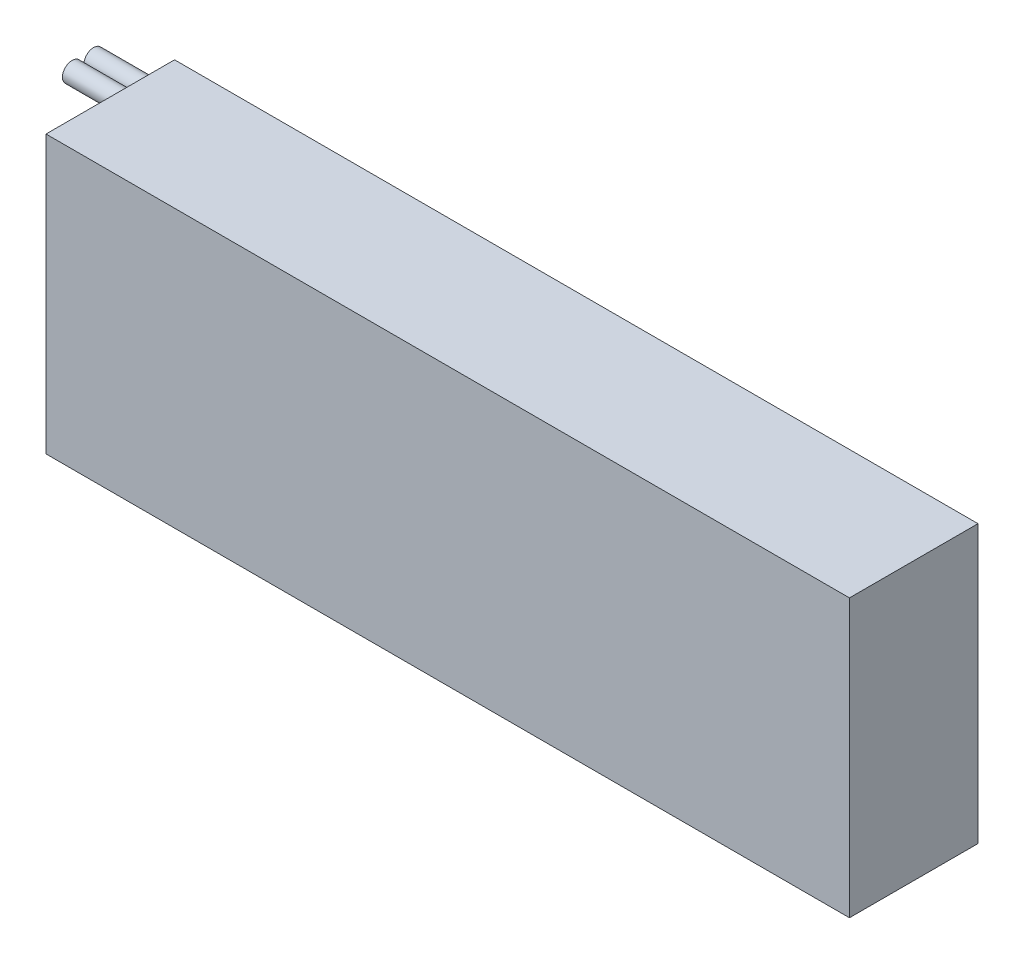
ISO-10303-21;
HEADER;
FILE_DESCRIPTION(('STEP AP214'),'2;1');
FILE_NAME('part.step','',(''),(''),'','','');
FILE_SCHEMA(('AUTOMOTIVE_DESIGN { 1 0 10303 214 1 1 1 1 }'));
ENDSEC;
DATA;
#1=APPLICATION_CONTEXT('core data for automotive mechanical design processes');
#2=APPLICATION_PROTOCOL_DEFINITION('international standard','automotive_design',2000,#1);
#3=PRODUCT_CONTEXT('',#1,'mechanical');
#4=PRODUCT('Part','Part','',(#3));
#5=PRODUCT_RELATED_PRODUCT_CATEGORY('part','',(#4));
#6=PRODUCT_DEFINITION_FORMATION('','',#4);
#7=PRODUCT_DEFINITION_CONTEXT('part definition',#1,'design');
#8=PRODUCT_DEFINITION('design','',#6,#7);
#9=PRODUCT_DEFINITION_SHAPE('','',#8);
#10=(LENGTH_UNIT() NAMED_UNIT(*) SI_UNIT(.MILLI.,.METRE.));
#11=(NAMED_UNIT(*) PLANE_ANGLE_UNIT() SI_UNIT($,.RADIAN.));
#12=(NAMED_UNIT(*) SI_UNIT($,.STERADIAN.) SOLID_ANGLE_UNIT());
#13=UNCERTAINTY_MEASURE_WITH_UNIT(LENGTH_MEASURE(1.E-05),#10,'distance_accuracy_value','');
#14=(GEOMETRIC_REPRESENTATION_CONTEXT(3) GLOBAL_UNCERTAINTY_ASSIGNED_CONTEXT((#13)) GLOBAL_UNIT_ASSIGNED_CONTEXT((#10,
#11,#12)) REPRESENTATION_CONTEXT('',''));
#15=CARTESIAN_POINT('',(0.,0.,0.));
#16=DIRECTION('',(0.,0.,1.));
#17=DIRECTION('',(1.,0.,0.));
#18=AXIS2_PLACEMENT_3D('',#15,#16,#17);
#19=CARTESIAN_POINT('',(-112.129237288136,36.0222457627119,23.2));
#20=DIRECTION('',(1.,0.,0.));
#21=DIRECTION('',(0.,0.,-1.));
#22=AXIS2_PLACEMENT_3D('',#19,#20,#21);
#23=PLANE('',#22);
#24=CARTESIAN_POINT('',(-112.129237288136,33.4218855490107,8.48750413764776));
#25=DIRECTION('',(1.,0.,0.));
#26=DIRECTION('',(0.,0.,-1.));
#27=AXIS2_PLACEMENT_3D('',#24,#25,#26);
#28=CIRCLE('',#27,1.75);
#29=CARTESIAN_POINT('',(-112.129237288136,33.4218855490107,6.73750413764776));
#30=VERTEX_POINT('',#29);
#31=EDGE_CURVE('E11',#30,#30,#28,.F.);
#32=ORIENTED_EDGE('',*,*,#31,.F.);
#33=EDGE_LOOP('',(#32));
#34=FACE_BOUND('',#33,.T.);
#35=CARTESIAN_POINT('',(-112.129237288136,33.4942220454977,4.61164557053451));
#36=DIRECTION('',(1.,0.,0.));
#37=DIRECTION('',(0.,0.,-1.));
#38=AXIS2_PLACEMENT_3D('',#35,#36,#37);
#39=CIRCLE('',#38,1.75);
#40=CARTESIAN_POINT('',(-112.129237288136,33.4942220454977,2.8616455705345));
#41=VERTEX_POINT('',#40);
#42=EDGE_CURVE('E41',#41,#41,#39,.F.);
#43=ORIENTED_EDGE('',*,*,#42,.F.);
#44=EDGE_LOOP('',(#43));
#45=FACE_BOUND('',#44,.T.);
#46=DIRECTION('',(0.,-1.,0.));
#47=VECTOR('',#46,1.);
#48=CARTESIAN_POINT('',(-112.129237288136,36.0222457627119,0.));
#49=LINE('',#48,#47);
#50=CARTESIAN_POINT('',(-112.129237288136,36.0222457627119,0.));
#51=VERTEX_POINT('',#50);
#52=CARTESIAN_POINT('',(-112.129237288136,-13.9777542372881,0.));
#53=VERTEX_POINT('',#52);
#54=EDGE_CURVE('E100',#51,#53,#49,.T.);
#55=ORIENTED_EDGE('',*,*,#54,.T.);
#56=DIRECTION('',(0.,0.,-1.));
#57=VECTOR('',#56,1.);
#58=CARTESIAN_POINT('',(-112.129237288136,-13.9777542372881,23.2));
#59=LINE('',#58,#57);
#60=CARTESIAN_POINT('',(-112.129237288136,-13.9777542372881,23.2));
#61=VERTEX_POINT('',#60);
#62=EDGE_CURVE('E91',#61,#53,#59,.T.);
#63=ORIENTED_EDGE('',*,*,#62,.F.);
#64=DIRECTION('',(0.,-1.,0.));
#65=VECTOR('',#64,1.);
#66=CARTESIAN_POINT('',(-112.129237288136,36.0222457627119,23.2));
#67=LINE('',#66,#65);
#68=CARTESIAN_POINT('',(-112.129237288136,36.0222457627119,23.2));
#69=VERTEX_POINT('',#68);
#70=EDGE_CURVE('E85',#69,#61,#67,.T.);
#71=ORIENTED_EDGE('',*,*,#70,.F.);
#72=DIRECTION('',(0.,0.,-1.));
#73=VECTOR('',#72,1.);
#74=CARTESIAN_POINT('',(-112.129237288136,36.0222457627119,23.2));
#75=LINE('',#74,#73);
#76=EDGE_CURVE('E96',#69,#51,#75,.T.);
#77=ORIENTED_EDGE('',*,*,#76,.T.);
#78=EDGE_LOOP('',(#55,#63,#71,#77));
#79=FACE_BOUND('',#78,.T.);
#80=ADVANCED_FACE('F33',(#34,#45,#79),#23,.F.);
#81=CARTESIAN_POINT('',(-112.129237288136,-13.9777542372881,23.2));
#82=DIRECTION('',(0.,1.,0.));
#83=DIRECTION('',(0.,0.,1.));
#84=AXIS2_PLACEMENT_3D('',#81,#82,#83);
#85=PLANE('',#84);
#86=DIRECTION('',(1.,0.,0.));
#87=VECTOR('',#86,1.);
#88=CARTESIAN_POINT('',(-112.129237288136,-13.9777542372881,0.));
#89=LINE('',#88,#87);
#90=CARTESIAN_POINT('',(32.8707627118644,-13.9777542372881,0.));
#91=VERTEX_POINT('',#90);
#92=EDGE_CURVE('E90',#53,#91,#89,.T.);
#93=ORIENTED_EDGE('',*,*,#92,.T.);
#94=DIRECTION('',(0.,0.,-1.));
#95=VECTOR('',#94,1.);
#96=CARTESIAN_POINT('',(32.8707627118644,-13.9777542372881,23.2));
#97=LINE('',#96,#95);
#98=CARTESIAN_POINT('',(32.8707627118644,-13.9777542372881,23.2));
#99=VERTEX_POINT('',#98);
#100=EDGE_CURVE('E88',#99,#91,#97,.T.);
#101=ORIENTED_EDGE('',*,*,#100,.F.);
#102=DIRECTION('',(1.,0.,0.));
#103=VECTOR('',#102,1.);
#104=CARTESIAN_POINT('',(-112.129237288136,-13.9777542372881,23.2));
#105=LINE('',#104,#103);
#106=EDGE_CURVE('E80',#61,#99,#105,.T.);
#107=ORIENTED_EDGE('',*,*,#106,.F.);
#108=ORIENTED_EDGE('',*,*,#62,.T.);
#109=EDGE_LOOP('',(#93,#101,#107,#108));
#110=FACE_BOUND('',#109,.T.);
#111=ADVANCED_FACE('F89',(#110),#85,.F.);
#112=CARTESIAN_POINT('',(32.8707627118644,36.0222457627119,23.2));
#113=DIRECTION('',(-1.,0.,0.));
#114=DIRECTION('',(0.,0.,1.));
#115=AXIS2_PLACEMENT_3D('',#112,#113,#114);
#116=PLANE('',#115);
#117=DIRECTION('',(0.,1.,0.));
#118=VECTOR('',#117,1.);
#119=CARTESIAN_POINT('',(32.8707627118644,36.0222457627119,0.));
#120=LINE('',#119,#118);
#121=CARTESIAN_POINT('',(32.8707627118644,36.0222457627119,0.));
#122=VERTEX_POINT('',#121);
#123=EDGE_CURVE('E66',#91,#122,#120,.T.);
#124=ORIENTED_EDGE('',*,*,#123,.T.);
#125=DIRECTION('',(0.,0.,-1.));
#126=VECTOR('',#125,1.);
#127=CARTESIAN_POINT('',(32.8707627118644,36.0222457627119,23.2));
#128=LINE('',#127,#126);
#129=CARTESIAN_POINT('',(32.8707627118644,36.0222457627119,23.2));
#130=VERTEX_POINT('',#129);
#131=EDGE_CURVE('E92',#130,#122,#128,.T.);
#132=ORIENTED_EDGE('',*,*,#131,.F.);
#133=DIRECTION('',(0.,1.,0.));
#134=VECTOR('',#133,1.);
#135=CARTESIAN_POINT('',(32.8707627118644,36.0222457627119,23.2));
#136=LINE('',#135,#134);
#137=EDGE_CURVE('E83',#99,#130,#136,.T.);
#138=ORIENTED_EDGE('',*,*,#137,.F.);
#139=ORIENTED_EDGE('',*,*,#100,.T.);
#140=EDGE_LOOP('',(#124,#132,#138,#139));
#141=FACE_BOUND('',#140,.T.);
#142=ADVANCED_FACE('F94',(#141),#116,.F.);
#143=CARTESIAN_POINT('',(-112.129237288136,36.0222457627119,23.2));
#144=DIRECTION('',(0.,-1.,0.));
#145=DIRECTION('',(0.,0.,-1.));
#146=AXIS2_PLACEMENT_3D('',#143,#144,#145);
#147=PLANE('',#146);
#148=DIRECTION('',(-1.,0.,0.));
#149=VECTOR('',#148,1.);
#150=CARTESIAN_POINT('',(-112.129237288136,36.0222457627119,0.));
#151=LINE('',#150,#149);
#152=EDGE_CURVE('E72',#122,#51,#151,.T.);
#153=ORIENTED_EDGE('',*,*,#152,.T.);
#154=ORIENTED_EDGE('',*,*,#76,.F.);
#155=DIRECTION('',(-1.,0.,0.));
#156=VECTOR('',#155,1.);
#157=CARTESIAN_POINT('',(-112.129237288136,36.0222457627119,23.2));
#158=LINE('',#157,#156);
#159=EDGE_CURVE('E49',#130,#69,#158,.T.);
#160=ORIENTED_EDGE('',*,*,#159,.F.);
#161=ORIENTED_EDGE('',*,*,#131,.T.);
#162=EDGE_LOOP('',(#153,#154,#160,#161));
#163=FACE_BOUND('',#162,.T.);
#164=ADVANCED_FACE('F129',(#163),#147,.F.);
#165=CARTESIAN_POINT('',(0.,0.,23.2));
#166=DIRECTION('',(0.,0.,1.));
#167=DIRECTION('',(1.,0.,0.));
#168=AXIS2_PLACEMENT_3D('',#165,#166,#167);
#169=PLANE('',#168);
#170=ORIENTED_EDGE('',*,*,#70,.T.);
#171=ORIENTED_EDGE('',*,*,#106,.T.);
#172=ORIENTED_EDGE('',*,*,#137,.T.);
#173=ORIENTED_EDGE('',*,*,#159,.T.);
#174=EDGE_LOOP('',(#170,#171,#172,#173));
#175=FACE_BOUND('',#174,.T.);
#176=ADVANCED_FACE('F81',(#175),#169,.T.);
#177=CARTESIAN_POINT('',(0.,0.,0.));
#178=DIRECTION('',(0.,0.,1.));
#179=DIRECTION('',(1.,0.,0.));
#180=AXIS2_PLACEMENT_3D('',#177,#178,#179);
#181=PLANE('',#180);
#182=ORIENTED_EDGE('',*,*,#54,.F.);
#183=ORIENTED_EDGE('',*,*,#152,.F.);
#184=ORIENTED_EDGE('',*,*,#123,.F.);
#185=ORIENTED_EDGE('',*,*,#92,.F.);
#186=EDGE_LOOP('',(#182,#183,#184,#185));
#187=FACE_BOUND('',#186,.T.);
#188=ADVANCED_FACE('F119',(#187),#181,.F.);
#189=CARTESIAN_POINT('',(-122.129237288136,33.4942220454977,4.61164557053451));
#190=DIRECTION('',(1.,0.,0.));
#191=DIRECTION('',(0.,0.,-1.));
#192=AXIS2_PLACEMENT_3D('',#189,#190,#191);
#193=CYLINDRICAL_SURFACE('',#192,1.75);
#194=CARTESIAN_POINT('',(-122.129237288136,33.4942220454977,4.61164557053451));
#195=DIRECTION('',(-1.,0.,0.));
#196=DIRECTION('',(0.,0.,1.));
#197=AXIS2_PLACEMENT_3D('',#194,#195,#196);
#198=CIRCLE('',#197,1.75);
#199=CARTESIAN_POINT('',(-122.129237288136,33.4942220454977,6.36164557053451));
#200=VERTEX_POINT('',#199);
#201=EDGE_CURVE('E103',#200,#200,#198,.T.);
#202=ORIENTED_EDGE('',*,*,#201,.F.);
#203=EDGE_LOOP('',(#202));
#204=FACE_BOUND('',#203,.T.);
#205=ORIENTED_EDGE('',*,*,#42,.T.);
#206=EDGE_LOOP('',(#205));
#207=FACE_BOUND('',#206,.T.);
#208=ADVANCED_FACE('F112',(#204,#207),#193,.T.);
#209=CARTESIAN_POINT('',(-122.129237288136,33.4942220454977,4.61164557053451));
#210=DIRECTION('',(-1.,0.,0.));
#211=DIRECTION('',(0.,0.,1.));
#212=AXIS2_PLACEMENT_3D('',#209,#210,#211);
#213=PLANE('',#212);
#214=ORIENTED_EDGE('',*,*,#201,.T.);
#215=EDGE_LOOP('',(#214));
#216=FACE_BOUND('',#215,.T.);
#217=ADVANCED_FACE('F126',(#216),#213,.T.);
#218=CARTESIAN_POINT('',(-122.129237288136,33.4218855490107,8.48750413764776));
#219=DIRECTION('',(1.,0.,0.));
#220=DIRECTION('',(0.,0.,-1.));
#221=AXIS2_PLACEMENT_3D('',#218,#219,#220);
#222=CYLINDRICAL_SURFACE('',#221,1.75);
#223=CARTESIAN_POINT('',(-122.129237288136,33.4218855490107,8.48750413764776));
#224=DIRECTION('',(-1.,0.,0.));
#225=DIRECTION('',(0.,0.,1.));
#226=AXIS2_PLACEMENT_3D('',#223,#224,#225);
#227=CIRCLE('',#226,1.75);
#228=CARTESIAN_POINT('',(-122.129237288136,33.4218855490107,10.2375041376478));
#229=VERTEX_POINT('',#228);
#230=EDGE_CURVE('E201',#229,#229,#227,.T.);
#231=ORIENTED_EDGE('',*,*,#230,.F.);
#232=EDGE_LOOP('',(#231));
#233=FACE_BOUND('',#232,.T.);
#234=ORIENTED_EDGE('',*,*,#31,.T.);
#235=EDGE_LOOP('',(#234));
#236=FACE_BOUND('',#235,.T.);
#237=ADVANCED_FACE('F170',(#233,#236),#222,.T.);
#238=CARTESIAN_POINT('',(-122.129237288136,33.4218855490107,8.48750413764776));
#239=DIRECTION('',(-1.,0.,0.));
#240=DIRECTION('',(0.,0.,1.));
#241=AXIS2_PLACEMENT_3D('',#238,#239,#240);
#242=PLANE('',#241);
#243=ORIENTED_EDGE('',*,*,#230,.T.);
#244=EDGE_LOOP('',(#243));
#245=FACE_BOUND('',#244,.T.);
#246=ADVANCED_FACE('F185',(#245),#242,.T.);
#247=CLOSED_SHELL('',(#80,#111,#142,#164,#176,#188,#208,#217,#237,#246));
#248=MANIFOLD_SOLID_BREP('B2',#247);
#249=ADVANCED_BREP_SHAPE_REPRESENTATION('',(#18,#248),#14);
#250=SHAPE_DEFINITION_REPRESENTATION(#9,#249);
ENDSEC;
END-ISO-10303-21;
